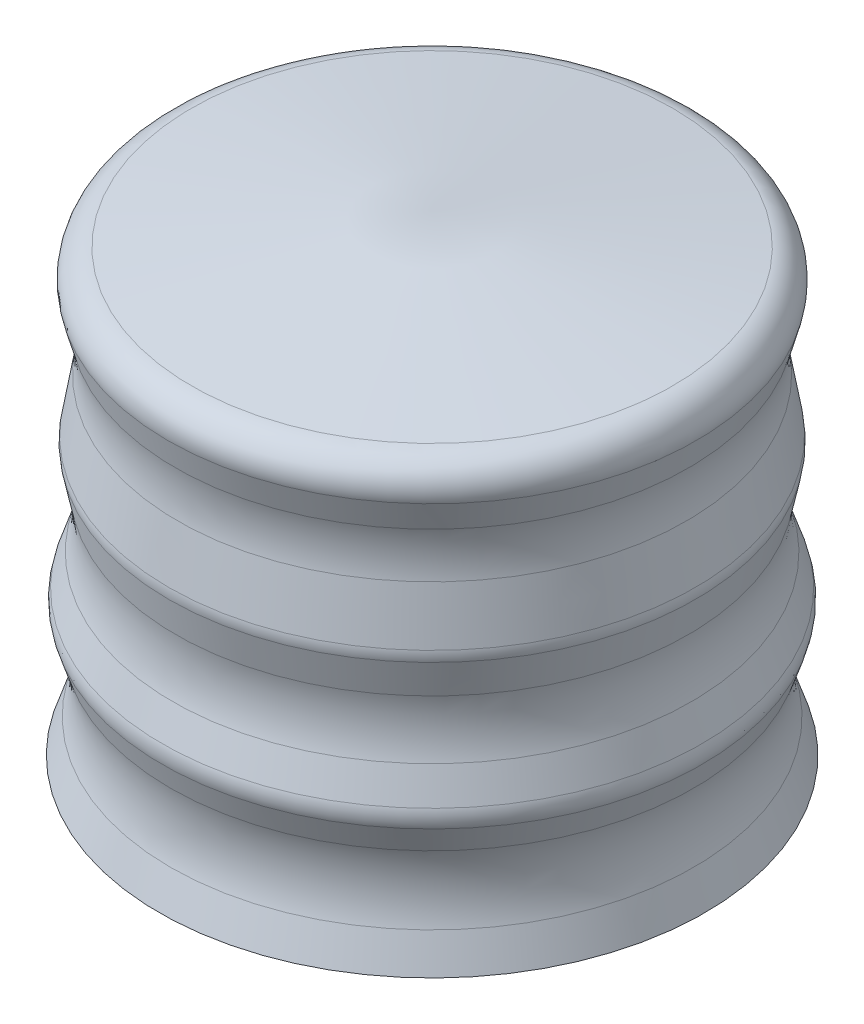
ISO-10303-21;
HEADER;
FILE_DESCRIPTION(('STEP AP214'),'2;1');
FILE_NAME('part.step','',(''),(''),'','','');
FILE_SCHEMA(('AUTOMOTIVE_DESIGN { 1 0 10303 214 1 1 1 1 }'));
ENDSEC;
DATA;
#1=APPLICATION_CONTEXT('core data for automotive mechanical design processes');
#2=APPLICATION_PROTOCOL_DEFINITION('international standard','automotive_design',2000,#1);
#3=PRODUCT_CONTEXT('',#1,'mechanical');
#4=PRODUCT('Part','Part','',(#3));
#5=PRODUCT_RELATED_PRODUCT_CATEGORY('part','',(#4));
#6=PRODUCT_DEFINITION_FORMATION('','',#4);
#7=PRODUCT_DEFINITION_CONTEXT('part definition',#1,'design');
#8=PRODUCT_DEFINITION('design','',#6,#7);
#9=PRODUCT_DEFINITION_SHAPE('','',#8);
#10=(LENGTH_UNIT() NAMED_UNIT(*) SI_UNIT(.MILLI.,.METRE.));
#11=(NAMED_UNIT(*) PLANE_ANGLE_UNIT() SI_UNIT($,.RADIAN.));
#12=(NAMED_UNIT(*) SI_UNIT($,.STERADIAN.) SOLID_ANGLE_UNIT());
#13=UNCERTAINTY_MEASURE_WITH_UNIT(LENGTH_MEASURE(1.E-05),#10,'distance_accuracy_value','');
#14=(GEOMETRIC_REPRESENTATION_CONTEXT(3) GLOBAL_UNCERTAINTY_ASSIGNED_CONTEXT((#13)) GLOBAL_UNIT_ASSIGNED_CONTEXT((#10,
#11,#12)) REPRESENTATION_CONTEXT('',''));
#15=CARTESIAN_POINT('',(0.,0.,0.));
#16=DIRECTION('',(0.,0.,1.));
#17=DIRECTION('',(1.,0.,0.));
#18=AXIS2_PLACEMENT_3D('',#15,#16,#17);
#19=CARTESIAN_POINT('',(0.,0.,0.));
#20=DIRECTION('',(0.,-1.,0.));
#21=DIRECTION('',(0.,0.,-1.));
#22=AXIS2_PLACEMENT_3D('',#19,#20,#21);
#23=PLANE('',#22);
#24=CARTESIAN_POINT('',(0.,0.,0.));
#25=DIRECTION('',(0.,-1.,0.));
#26=DIRECTION('',(0.,0.,-1.));
#27=AXIS2_PLACEMENT_3D('',#24,#25,#26);
#28=CIRCLE('',#27,4.82);
#29=CARTESIAN_POINT('',(0.,0.,-4.82));
#30=VERTEX_POINT('',#29);
#31=EDGE_CURVE('E11',#30,#30,#28,.T.);
#32=ORIENTED_EDGE('',*,*,#31,.T.);
#33=EDGE_LOOP('',(#32));
#34=FACE_BOUND('',#33,.T.);
#35=DIRECTION('',(1.,0.,0.));
#36=VECTOR('',#35,1.);
#37=CARTESIAN_POINT('',(1.55,0.,-0.25));
#38=LINE('',#37,#36);
#39=CARTESIAN_POINT('',(1.55,0.,-0.25));
#40=VERTEX_POINT('',#39);
#41=CARTESIAN_POINT('',(3.05,0.,-0.25));
#42=VERTEX_POINT('',#41);
#43=EDGE_CURVE('E223',#40,#42,#38,.T.);
#44=ORIENTED_EDGE('',*,*,#43,.F.);
#45=CARTESIAN_POINT('',(1.55,0.,0.));
#46=DIRECTION('',(0.,-1.,0.));
#47=DIRECTION('',(0.,0.,1.));
#48=AXIS2_PLACEMENT_3D('',#45,#46,#47);
#49=CIRCLE('',#48,0.25);
#50=CARTESIAN_POINT('',(1.55,0.,0.25));
#51=VERTEX_POINT('',#50);
#52=EDGE_CURVE('E219',#51,#40,#49,.T.);
#53=ORIENTED_EDGE('',*,*,#52,.F.);
#54=DIRECTION('',(-1.,0.,0.));
#55=VECTOR('',#54,1.);
#56=CARTESIAN_POINT('',(1.55,0.,0.25));
#57=LINE('',#56,#55);
#58=CARTESIAN_POINT('',(3.05,0.,0.25));
#59=VERTEX_POINT('',#58);
#60=EDGE_CURVE('E231',#59,#51,#57,.T.);
#61=ORIENTED_EDGE('',*,*,#60,.F.);
#62=CARTESIAN_POINT('',(3.05,0.,0.));
#63=DIRECTION('',(0.,-1.,0.));
#64=DIRECTION('',(0.,0.,-1.));
#65=AXIS2_PLACEMENT_3D('',#62,#63,#64);
#66=CIRCLE('',#65,0.25);
#67=EDGE_CURVE('E227',#42,#59,#66,.T.);
#68=ORIENTED_EDGE('',*,*,#67,.F.);
#69=EDGE_LOOP('',(#44,#53,#61,#68));
#70=FACE_BOUND('',#69,.T.);
#71=DIRECTION('',(0.,0.,1.));
#72=VECTOR('',#71,1.);
#73=CARTESIAN_POINT('',(0.249999999999995,0.,1.55));
#74=LINE('',#73,#72);
#75=CARTESIAN_POINT('',(0.249999999999995,0.,1.55));
#76=VERTEX_POINT('',#75);
#77=CARTESIAN_POINT('',(0.249999999999989,0.,3.05));
#78=VERTEX_POINT('',#77);
#79=EDGE_CURVE('E109',#76,#78,#74,.T.);
#80=ORIENTED_EDGE('',*,*,#79,.F.);
#81=CARTESIAN_POINT('',(0.,0.,1.55));
#82=DIRECTION('',(0.,-1.,0.));
#83=DIRECTION('',(-1.,0.,0.));
#84=AXIS2_PLACEMENT_3D('',#81,#82,#83);
#85=CIRCLE('',#84,0.25);
#86=CARTESIAN_POINT('',(-0.250000000000005,0.,1.55));
#87=VERTEX_POINT('',#86);
#88=EDGE_CURVE('E209',#87,#76,#85,.T.);
#89=ORIENTED_EDGE('',*,*,#88,.F.);
#90=DIRECTION('',(0.,0.,-1.));
#91=VECTOR('',#90,1.);
#92=CARTESIAN_POINT('',(-0.250000000000005,0.,1.55));
#93=LINE('',#92,#91);
#94=CARTESIAN_POINT('',(-0.250000000000011,0.,3.05));
#95=VERTEX_POINT('',#94);
#96=EDGE_CURVE('E216',#95,#87,#93,.T.);
#97=ORIENTED_EDGE('',*,*,#96,.F.);
#98=CARTESIAN_POINT('',(0.,0.,3.05));
#99=DIRECTION('',(0.,-1.,0.));
#100=DIRECTION('',(1.,0.,0.));
#101=AXIS2_PLACEMENT_3D('',#98,#99,#100);
#102=CIRCLE('',#101,0.25);
#103=EDGE_CURVE('E117',#78,#95,#102,.T.);
#104=ORIENTED_EDGE('',*,*,#103,.F.);
#105=EDGE_LOOP('',(#80,#89,#97,#104));
#106=FACE_BOUND('',#105,.T.);
#107=DIRECTION('',(-1.,0.,0.));
#108=VECTOR('',#107,1.);
#109=CARTESIAN_POINT('',(-1.55,0.,0.25));
#110=LINE('',#109,#108);
#111=CARTESIAN_POINT('',(-1.55,0.,0.25));
#112=VERTEX_POINT('',#111);
#113=CARTESIAN_POINT('',(-3.05,0.,0.25));
#114=VERTEX_POINT('',#113);
#115=EDGE_CURVE('E197',#112,#114,#110,.T.);
#116=ORIENTED_EDGE('',*,*,#115,.F.);
#117=CARTESIAN_POINT('',(-1.55,0.,0.));
#118=DIRECTION('',(0.,-1.,0.));
#119=DIRECTION('',(0.,0.,-1.));
#120=AXIS2_PLACEMENT_3D('',#117,#118,#119);
#121=CIRCLE('',#120,0.25);
#122=CARTESIAN_POINT('',(-1.55,0.,-0.25));
#123=VERTEX_POINT('',#122);
#124=EDGE_CURVE('E193',#123,#112,#121,.T.);
#125=ORIENTED_EDGE('',*,*,#124,.F.);
#126=DIRECTION('',(1.,0.,0.));
#127=VECTOR('',#126,1.);
#128=CARTESIAN_POINT('',(-1.55,0.,-0.25));
#129=LINE('',#128,#127);
#130=CARTESIAN_POINT('',(-3.05,0.,-0.25));
#131=VERTEX_POINT('',#130);
#132=EDGE_CURVE('E205',#131,#123,#129,.T.);
#133=ORIENTED_EDGE('',*,*,#132,.F.);
#134=CARTESIAN_POINT('',(-3.05,0.,0.));
#135=DIRECTION('',(0.,-1.,0.));
#136=DIRECTION('',(0.,0.,1.));
#137=AXIS2_PLACEMENT_3D('',#134,#135,#136);
#138=CIRCLE('',#137,0.25);
#139=EDGE_CURVE('E201',#114,#131,#138,.T.);
#140=ORIENTED_EDGE('',*,*,#139,.F.);
#141=EDGE_LOOP('',(#116,#125,#133,#140));
#142=FACE_BOUND('',#141,.T.);
#143=DIRECTION('',(0.,0.,-1.));
#144=VECTOR('',#143,1.);
#145=CARTESIAN_POINT('',(-0.249999999999984,0.,-1.55));
#146=LINE('',#145,#144);
#147=CARTESIAN_POINT('',(-0.249999999999984,0.,-1.55));
#148=VERTEX_POINT('',#147);
#149=CARTESIAN_POINT('',(-0.249999999999968,0.,-3.05));
#150=VERTEX_POINT('',#149);
#151=EDGE_CURVE('E183',#148,#150,#146,.T.);
#152=ORIENTED_EDGE('',*,*,#151,.F.);
#153=CARTESIAN_POINT('',(0.,0.,-1.55));
#154=DIRECTION('',(0.,-1.,0.));
#155=DIRECTION('',(1.,0.,0.));
#156=AXIS2_PLACEMENT_3D('',#153,#154,#155);
#157=CIRCLE('',#156,0.25);
#158=CARTESIAN_POINT('',(0.250000000000016,0.,-1.55));
#159=VERTEX_POINT('',#158);
#160=EDGE_CURVE('E179',#159,#148,#157,.T.);
#161=ORIENTED_EDGE('',*,*,#160,.F.);
#162=DIRECTION('',(0.,0.,1.));
#163=VECTOR('',#162,1.);
#164=CARTESIAN_POINT('',(0.250000000000016,0.,-1.55));
#165=LINE('',#164,#163);
#166=CARTESIAN_POINT('',(0.250000000000032,0.,-3.05));
#167=VERTEX_POINT('',#166);
#168=EDGE_CURVE('E190',#167,#159,#165,.T.);
#169=ORIENTED_EDGE('',*,*,#168,.F.);
#170=CARTESIAN_POINT('',(0.,0.,-3.05));
#171=DIRECTION('',(0.,-1.,0.));
#172=DIRECTION('',(-1.,0.,0.));
#173=AXIS2_PLACEMENT_3D('',#170,#171,#172);
#174=CIRCLE('',#173,0.25);
#175=EDGE_CURVE('E187',#150,#167,#174,.T.);
#176=ORIENTED_EDGE('',*,*,#175,.F.);
#177=EDGE_LOOP('',(#152,#161,#169,#176));
#178=FACE_BOUND('',#177,.T.);
#179=ADVANCED_FACE('F45',(#34,#70,#106,#142,#178),#23,.T.);
#180=CARTESIAN_POINT('',(0.,0.,0.));
#181=DIRECTION('',(0.,-1.,0.));
#182=DIRECTION('',(0.,0.,-1.));
#183=AXIS2_PLACEMENT_3D('',#180,#181,#182);
#184=CONICAL_SURFACE('',#183,4.82,0.321750554396642);
#185=CARTESIAN_POINT('',(0.,0.595056283609781,0.));
#186=DIRECTION('',(0.,-1.,0.));
#187=DIRECTION('',(0.,0.,-1.));
#188=AXIS2_PLACEMENT_3D('',#185,#186,#187);
#189=CIRCLE('',#188,4.62164790546341);
#190=CARTESIAN_POINT('',(0.,0.595056283609781,-4.62164790546341));
#191=VERTEX_POINT('',#190);
#192=EDGE_CURVE('E56',#191,#191,#189,.T.);
#193=ORIENTED_EDGE('',*,*,#192,.T.);
#194=EDGE_LOOP('',(#193));
#195=FACE_BOUND('',#194,.T.);
#196=ORIENTED_EDGE('',*,*,#31,.F.);
#197=EDGE_LOOP('',(#196));
#198=FACE_BOUND('',#197,.T.);
#199=ADVANCED_FACE('F284',(#195,#198),#184,.T.);
#200=CARTESIAN_POINT('',(0.,1.2,0.));
#201=DIRECTION('',(0.,-1.,0.));
#202=DIRECTION('',(0.,0.,-1.));
#203=AXIS2_PLACEMENT_3D('',#200,#201,#202);
#204=TOROIDAL_SURFACE('',#203,6.43647905463404,1.913);
#205=CARTESIAN_POINT('',(0.,1.80494371639022,0.));
#206=DIRECTION('',(0.,-1.,0.));
#207=DIRECTION('',(0.,0.,-1.));
#208=AXIS2_PLACEMENT_3D('',#205,#206,#207);
#209=CIRCLE('',#208,4.62164790546341);
#210=CARTESIAN_POINT('',(0.,1.80494371639022,-4.62164790546341));
#211=VERTEX_POINT('',#210);
#212=EDGE_CURVE('E275',#211,#211,#209,.T.);
#213=ORIENTED_EDGE('',*,*,#212,.T.);
#214=EDGE_LOOP('',(#213));
#215=FACE_BOUND('',#214,.T.);
#216=ORIENTED_EDGE('',*,*,#192,.F.);
#217=EDGE_LOOP('',(#216));
#218=FACE_BOUND('',#217,.T.);
#219=ADVANCED_FACE('F287',(#215,#218),#204,.F.);
#220=CARTESIAN_POINT('',(0.,1.80494371639022,0.));
#221=DIRECTION('',(0.,1.,0.));
#222=DIRECTION('',(0.,0.,1.));
#223=AXIS2_PLACEMENT_3D('',#220,#221,#222);
#224=CONICAL_SURFACE('',#223,4.62164790546341,0.321750554396642);
#225=CARTESIAN_POINT('',(0.,2.24188611699158,0.));
#226=DIRECTION('',(0.,-1.,0.));
#227=DIRECTION('',(0.,0.,-1.));
#228=AXIS2_PLACEMENT_3D('',#225,#226,#227);
#229=CIRCLE('',#228,4.76729537233053);
#230=CARTESIAN_POINT('',(0.,2.24188611699158,-4.76729537233053));
#231=VERTEX_POINT('',#230);
#232=EDGE_CURVE('E271',#231,#231,#229,.T.);
#233=ORIENTED_EDGE('',*,*,#232,.T.);
#234=EDGE_LOOP('',(#233));
#235=FACE_BOUND('',#234,.T.);
#236=ORIENTED_EDGE('',*,*,#212,.F.);
#237=EDGE_LOOP('',(#236));
#238=FACE_BOUND('',#237,.T.);
#239=ADVANCED_FACE('F289',(#235,#238),#224,.T.);
#240=CARTESIAN_POINT('',(0.,2.4,0.));
#241=DIRECTION('',(0.,-1.,0.));
#242=DIRECTION('',(0.,0.,-1.));
#243=AXIS2_PLACEMENT_3D('',#240,#241,#242);
#244=TOROIDAL_SURFACE('',#243,4.29295372330527,0.500000000000001);
#245=CARTESIAN_POINT('',(0.,2.55811388300842,0.));
#246=DIRECTION('',(0.,-1.,0.));
#247=DIRECTION('',(0.,0.,-1.));
#248=AXIS2_PLACEMENT_3D('',#245,#246,#247);
#249=CIRCLE('',#248,4.76729537233053);
#250=CARTESIAN_POINT('',(0.,2.55811388300842,-4.76729537233053));
#251=VERTEX_POINT('',#250);
#252=EDGE_CURVE('E267',#251,#251,#249,.T.);
#253=ORIENTED_EDGE('',*,*,#252,.T.);
#254=EDGE_LOOP('',(#253));
#255=FACE_BOUND('',#254,.T.);
#256=ORIENTED_EDGE('',*,*,#232,.F.);
#257=EDGE_LOOP('',(#256));
#258=FACE_BOUND('',#257,.T.);
#259=ADVANCED_FACE('F296',(#255,#258),#244,.T.);
#260=CARTESIAN_POINT('',(0.,2.55811388300842,0.));
#261=DIRECTION('',(0.,-1.,0.));
#262=DIRECTION('',(0.,0.,-1.));
#263=AXIS2_PLACEMENT_3D('',#260,#261,#262);
#264=CONICAL_SURFACE('',#263,4.76729537233053,0.321750554396642);
#265=CARTESIAN_POINT('',(0.,3.11026596358229,0.));
#266=DIRECTION('',(0.,-1.,0.));
#267=DIRECTION('',(0.,0.,-1.));
#268=AXIS2_PLACEMENT_3D('',#265,#266,#267);
#269=CIRCLE('',#268,4.5832446788059);
#270=CARTESIAN_POINT('',(0.,3.11026596358229,-4.5832446788059));
#271=VERTEX_POINT('',#270);
#272=EDGE_CURVE('E263',#271,#271,#269,.T.);
#273=ORIENTED_EDGE('',*,*,#272,.T.);
#274=EDGE_LOOP('',(#273));
#275=FACE_BOUND('',#274,.T.);
#276=ORIENTED_EDGE('',*,*,#252,.F.);
#277=EDGE_LOOP('',(#276));
#278=FACE_BOUND('',#277,.T.);
#279=ADVANCED_FACE('F475',(#275,#278),#264,.T.);
#280=CARTESIAN_POINT('',(0.,3.71520967997251,0.));
#281=DIRECTION('',(0.,-1.,0.));
#282=DIRECTION('',(0.,0.,-1.));
#283=AXIS2_PLACEMENT_3D('',#280,#281,#282);
#284=TOROIDAL_SURFACE('',#283,6.39807582797653,1.913);
#285=CARTESIAN_POINT('',(0.,4.10537416808878,0.));
#286=DIRECTION('',(0.,-1.,0.));
#287=DIRECTION('',(0.,0.,-1.));
#288=AXIS2_PLACEMENT_3D('',#285,#286,#287);
#289=CIRCLE('',#288,4.5252862850185);
#290=CARTESIAN_POINT('',(0.,4.10537416808878,-4.5252862850185));
#291=VERTEX_POINT('',#290);
#292=EDGE_CURVE('E259',#291,#291,#289,.T.);
#293=ORIENTED_EDGE('',*,*,#292,.T.);
#294=EDGE_LOOP('',(#293));
#295=FACE_BOUND('',#294,.T.);
#296=ORIENTED_EDGE('',*,*,#272,.F.);
#297=EDGE_LOOP('',(#296));
#298=FACE_BOUND('',#297,.T.);
#299=ADVANCED_FACE('F467',(#295,#298),#284,.F.);
#300=CARTESIAN_POINT('',(0.,4.10537416808878,0.));
#301=DIRECTION('',(0.,1.,0.));
#302=DIRECTION('',(0.,0.,1.));
#303=AXIS2_PLACEMENT_3D('',#300,#301,#302);
#304=CONICAL_SURFACE('',#303,4.5252862850185,0.205395389189767);
#305=CARTESIAN_POINT('',(0.,4.70684300208481,0.));
#306=DIRECTION('',(0.,-1.,0.));
#307=DIRECTION('',(0.,0.,-1.));
#308=AXIS2_PLACEMENT_3D('',#305,#306,#307);
#309=CIRCLE('',#308,4.650592292101);
#310=CARTESIAN_POINT('',(0.,4.70684300208481,-4.650592292101));
#311=VERTEX_POINT('',#310);
#312=EDGE_CURVE('E255',#311,#311,#309,.T.);
#313=ORIENTED_EDGE('',*,*,#312,.T.);
#314=EDGE_LOOP('',(#313));
#315=FACE_BOUND('',#314,.T.);
#316=ORIENTED_EDGE('',*,*,#292,.F.);
#317=EDGE_LOOP('',(#316));
#318=FACE_BOUND('',#317,.T.);
#319=ADVANCED_FACE('F459',(#315,#318),#304,.T.);
#320=CARTESIAN_POINT('',(0.,4.80882012914081,0.));
#321=DIRECTION('',(0.,-1.,0.));
#322=DIRECTION('',(0.,0.,-1.));
#323=AXIS2_PLACEMENT_3D('',#320,#321,#322);
#324=TOROIDAL_SURFACE('',#323,4.1611020822322,0.5);
#325=CARTESIAN_POINT('',(0.,4.89377358739463,0.));
#326=DIRECTION('',(0.,-1.,0.));
#327=DIRECTION('',(0.,0.,-1.));
#328=AXIS2_PLACEMENT_3D('',#325,#326,#327);
#329=CIRCLE('',#328,4.65383214010437);
#330=CARTESIAN_POINT('',(0.,4.89377358739463,-4.65383214010437));
#331=VERTEX_POINT('',#330);
#332=EDGE_CURVE('E251',#331,#331,#329,.T.);
#333=ORIENTED_EDGE('',*,*,#332,.T.);
#334=EDGE_LOOP('',(#333));
#335=FACE_BOUND('',#334,.T.);
#336=ORIENTED_EDGE('',*,*,#312,.F.);
#337=EDGE_LOOP('',(#336));
#338=FACE_BOUND('',#337,.T.);
#339=ADVANCED_FACE('F451',(#335,#338),#324,.T.);
#340=CARTESIAN_POINT('',(0.,4.89377358739463,0.));
#341=DIRECTION('',(0.,-1.,0.));
#342=DIRECTION('',(0.,0.,-1.));
#343=AXIS2_PLACEMENT_3D('',#340,#341,#342);
#344=CONICAL_SURFACE('',#343,4.65383214010437,0.170735211475282);
#345=CARTESIAN_POINT('',(0.,5.82853227102925,0.));
#346=DIRECTION('',(0.,-1.,0.));
#347=DIRECTION('',(0.,0.,-1.));
#348=AXIS2_PLACEMENT_3D('',#345,#346,#347);
#349=CIRCLE('',#348,4.49266684982254);
#350=CARTESIAN_POINT('',(0.,5.82853227102925,-4.49266684982254));
#351=VERTEX_POINT('',#350);
#352=EDGE_CURVE('E247',#351,#351,#349,.T.);
#353=ORIENTED_EDGE('',*,*,#352,.T.);
#354=EDGE_LOOP('',(#353));
#355=FACE_BOUND('',#354,.T.);
#356=ORIENTED_EDGE('',*,*,#332,.F.);
#357=EDGE_LOOP('',(#356));
#358=FACE_BOUND('',#357,.T.);
#359=ADVANCED_FACE('F443',(#355,#358),#344,.T.);
#360=CARTESIAN_POINT('',(0.,6.15356420230839,0.));
#361=DIRECTION('',(0.,-1.,0.));
#362=DIRECTION('',(0.,0.,-1.));
#363=AXIS2_PLACEMENT_3D('',#360,#361,#362);
#364=TOROIDAL_SURFACE('',#363,6.37785205124148,1.913);
#365=CARTESIAN_POINT('',(0.,6.66228637572307,0.));
#366=DIRECTION('',(0.,-1.,0.));
#367=DIRECTION('',(0.,0.,-1.));
#368=AXIS2_PLACEMENT_3D('',#365,#366,#367);
#369=CIRCLE('',#368,4.53373417261326);
#370=CARTESIAN_POINT('',(0.,6.66228637572307,-4.53373417261326));
#371=VERTEX_POINT('',#370);
#372=EDGE_CURVE('E243',#371,#371,#369,.T.);
#373=ORIENTED_EDGE('',*,*,#372,.T.);
#374=EDGE_LOOP('',(#373));
#375=FACE_BOUND('',#374,.T.);
#376=ORIENTED_EDGE('',*,*,#352,.F.);
#377=EDGE_LOOP('',(#376));
#378=FACE_BOUND('',#377,.T.);
#379=ADVANCED_FACE('F435',(#375,#378),#364,.F.);
#380=CARTESIAN_POINT('',(0.,6.66228637572307,0.));
#381=DIRECTION('',(0.,1.,0.));
#382=DIRECTION('',(0.,0.,1.));
#383=AXIS2_PLACEMENT_3D('',#380,#381,#382);
#384=CONICAL_SURFACE('',#383,4.53373417261326,0.269167492785702);
#385=CARTESIAN_POINT('',(0.,7.14628675755192,0.));
#386=DIRECTION('',(0.,-1.,0.));
#387=DIRECTION('',(0.,0.,-1.));
#388=AXIS2_PLACEMENT_3D('',#385,#386,#387);
#389=CIRCLE('',#388,4.66725151932467);
#390=CARTESIAN_POINT('',(0.,7.14628675755192,-4.66725151932467));
#391=VERTEX_POINT('',#390);
#392=EDGE_CURVE('E239',#391,#391,#389,.T.);
#393=ORIENTED_EDGE('',*,*,#392,.T.);
#394=EDGE_LOOP('',(#393));
#395=FACE_BOUND('',#394,.T.);
#396=ORIENTED_EDGE('',*,*,#372,.F.);
#397=EDGE_LOOP('',(#396));
#398=FACE_BOUND('',#397,.T.);
#399=ADVANCED_FACE('F427',(#395,#398),#384,.T.);
#400=CARTESIAN_POINT('',(0.,7.27925125661483,0.));
#401=DIRECTION('',(0.,-1.,0.));
#402=DIRECTION('',(0.,0.,-1.));
#403=AXIS2_PLACEMENT_3D('',#400,#401,#402);
#404=TOROIDAL_SURFACE('',#403,4.18525521022163,0.5);
#405=CARTESIAN_POINT('',(0.,7.77497368730173,0.));
#406=DIRECTION('',(0.,-1.,0.));
#407=DIRECTION('',(0.,0.,-1.));
#408=AXIS2_PLACEMENT_3D('',#405,#406,#407);
#409=CIRCLE('',#408,4.25051830633165);
#410=CARTESIAN_POINT('',(0.,7.77497368730173,-4.25051830633165));
#411=VERTEX_POINT('',#410);
#412=EDGE_CURVE('E235',#411,#411,#409,.T.);
#413=ORIENTED_EDGE('',*,*,#412,.T.);
#414=EDGE_LOOP('',(#413));
#415=FACE_BOUND('',#414,.T.);
#416=ORIENTED_EDGE('',*,*,#392,.F.);
#417=EDGE_LOOP('',(#416));
#418=FACE_BOUND('',#417,.T.);
#419=ADVANCED_FACE('F419',(#415,#418),#404,.T.);
#420=CARTESIAN_POINT('',(0.,7.77497368730173,0.));
#421=DIRECTION('',(0.,-1.,0.));
#422=DIRECTION('',(0.,0.,-1.));
#423=AXIS2_PLACEMENT_3D('',#420,#421,#422);
#424=CONICAL_SURFACE('',#423,4.25051830633165,1.43989663289533);
#425=CARTESIAN_POINT('',(0.,8.33456503837122,0.));
#426=VERTEX_POINT('',#425);
#427=VERTEX_LOOP('',#426);
#428=FACE_BOUND('',#427,.T.);
#429=ORIENTED_EDGE('',*,*,#412,.F.);
#430=EDGE_LOOP('',(#429));
#431=FACE_BOUND('',#430,.T.);
#432=ADVANCED_FACE('F323',(#428,#431),#424,.T.);
#433=CARTESIAN_POINT('',(-3.05,0.,0.));
#434=DIRECTION('',(0.,1.,0.));
#435=DIRECTION('',(0.,0.,1.));
#436=AXIS2_PLACEMENT_3D('',#433,#434,#435);
#437=SPHERICAL_SURFACE('',#436,0.25);
#438=CARTESIAN_POINT('',(-3.05,0.,0.));
#439=DIRECTION('',(1.,0.,0.));
#440=DIRECTION('',(0.,0.,-1.));
#441=AXIS2_PLACEMENT_3D('',#438,#439,#440);
#442=CIRCLE('',#441,0.25);
#443=CARTESIAN_POINT('',(-3.05,-0.25,0.));
#444=VERTEX_POINT('',#443);
#445=EDGE_CURVE('E176',#114,#444,#442,.T.);
#446=ORIENTED_EDGE('',*,*,#445,.F.);
#447=ORIENTED_EDGE('',*,*,#139,.T.);
#448=CARTESIAN_POINT('',(-3.05,0.,0.));
#449=DIRECTION('',(1.,0.,0.));
#450=DIRECTION('',(0.,0.,-1.));
#451=AXIS2_PLACEMENT_3D('',#448,#449,#450);
#452=CIRCLE('',#451,0.25);
#453=EDGE_CURVE('E170',#444,#131,#452,.T.);
#454=ORIENTED_EDGE('',*,*,#453,.F.);
#455=EDGE_LOOP('',(#446,#447,#454));
#456=FACE_BOUND('',#455,.T.);
#457=ADVANCED_FACE('F319',(#456),#437,.T.);
#458=CARTESIAN_POINT('',(-1.55,0.,0.));
#459=DIRECTION('',(-1.,0.,0.));
#460=DIRECTION('',(0.,0.,1.));
#461=AXIS2_PLACEMENT_3D('',#458,#459,#460);
#462=CYLINDRICAL_SURFACE('',#461,0.25);
#463=CARTESIAN_POINT('',(-1.55,0.,0.));
#464=DIRECTION('',(1.,0.,0.));
#465=DIRECTION('',(0.,0.,-1.));
#466=AXIS2_PLACEMENT_3D('',#463,#464,#465);
#467=CIRCLE('',#466,0.25);
#468=CARTESIAN_POINT('',(-1.55,-0.25,0.));
#469=VERTEX_POINT('',#468);
#470=EDGE_CURVE('E173',#112,#469,#467,.T.);
#471=ORIENTED_EDGE('',*,*,#470,.F.);
#472=ORIENTED_EDGE('',*,*,#115,.T.);
#473=ORIENTED_EDGE('',*,*,#445,.T.);
#474=DIRECTION('',(-1.,0.,0.));
#475=VECTOR('',#474,1.);
#476=CARTESIAN_POINT('',(-1.55,-0.25,0.));
#477=LINE('',#476,#475);
#478=EDGE_CURVE('E166',#469,#444,#477,.T.);
#479=ORIENTED_EDGE('',*,*,#478,.F.);
#480=EDGE_LOOP('',(#471,#472,#473,#479));
#481=FACE_BOUND('',#480,.T.);
#482=ADVANCED_FACE('F315',(#481),#462,.T.);
#483=CARTESIAN_POINT('',(-1.55,0.,0.));
#484=DIRECTION('',(0.,1.,0.));
#485=DIRECTION('',(0.,0.,1.));
#486=AXIS2_PLACEMENT_3D('',#483,#484,#485);
#487=SPHERICAL_SURFACE('',#486,0.25);
#488=ORIENTED_EDGE('',*,*,#124,.T.);
#489=ORIENTED_EDGE('',*,*,#470,.T.);
#490=CARTESIAN_POINT('',(-1.55,0.,0.));
#491=DIRECTION('',(-1.,0.,0.));
#492=DIRECTION('',(0.,0.,1.));
#493=AXIS2_PLACEMENT_3D('',#490,#491,#492);
#494=CIRCLE('',#493,0.25);
#495=EDGE_CURVE('E162',#123,#469,#494,.T.);
#496=ORIENTED_EDGE('',*,*,#495,.F.);
#497=EDGE_LOOP('',(#488,#489,#496));
#498=FACE_BOUND('',#497,.T.);
#499=ADVANCED_FACE('F311',(#498),#487,.T.);
#500=CARTESIAN_POINT('',(-1.55,0.,0.));
#501=DIRECTION('',(1.,0.,0.));
#502=DIRECTION('',(0.,0.,-1.));
#503=AXIS2_PLACEMENT_3D('',#500,#501,#502);
#504=CYLINDRICAL_SURFACE('',#503,0.25);
#505=ORIENTED_EDGE('',*,*,#453,.T.);
#506=ORIENTED_EDGE('',*,*,#132,.T.);
#507=ORIENTED_EDGE('',*,*,#495,.T.);
#508=ORIENTED_EDGE('',*,*,#478,.T.);
#509=EDGE_LOOP('',(#505,#506,#507,#508));
#510=FACE_BOUND('',#509,.T.);
#511=ADVANCED_FACE('F307',(#510),#504,.T.);
#512=CARTESIAN_POINT('',(0.,0.,-3.05));
#513=DIRECTION('',(0.,1.,0.));
#514=DIRECTION('',(0.,0.,1.));
#515=AXIS2_PLACEMENT_3D('',#512,#513,#514);
#516=SPHERICAL_SURFACE('',#515,0.25);
#517=CARTESIAN_POINT('',(0.,0.,-3.05));
#518=DIRECTION('',(0.,0.,1.));
#519=DIRECTION('',(1.,0.,0.));
#520=AXIS2_PLACEMENT_3D('',#517,#518,#519);
#521=CIRCLE('',#520,0.25);
#522=CARTESIAN_POINT('',(0.,-0.25,-3.05));
#523=VERTEX_POINT('',#522);
#524=EDGE_CURVE('E159',#150,#523,#521,.T.);
#525=ORIENTED_EDGE('',*,*,#524,.F.);
#526=ORIENTED_EDGE('',*,*,#175,.T.);
#527=CARTESIAN_POINT('',(0.,0.,-3.05));
#528=DIRECTION('',(0.,0.,1.));
#529=DIRECTION('',(1.,0.,0.));
#530=AXIS2_PLACEMENT_3D('',#527,#528,#529);
#531=CIRCLE('',#530,0.25);
#532=EDGE_CURVE('E65',#523,#167,#531,.T.);
#533=ORIENTED_EDGE('',*,*,#532,.F.);
#534=EDGE_LOOP('',(#525,#526,#533));
#535=FACE_BOUND('',#534,.T.);
#536=ADVANCED_FACE('F310',(#535),#516,.T.);
#537=CARTESIAN_POINT('',(0.,0.,-1.55));
#538=DIRECTION('',(0.,0.,-1.));
#539=DIRECTION('',(-1.,0.,0.));
#540=AXIS2_PLACEMENT_3D('',#537,#538,#539);
#541=CYLINDRICAL_SURFACE('',#540,0.25);
#542=CARTESIAN_POINT('',(0.,0.,-1.55));
#543=DIRECTION('',(0.,0.,1.));
#544=DIRECTION('',(1.,0.,0.));
#545=AXIS2_PLACEMENT_3D('',#542,#543,#544);
#546=CIRCLE('',#545,0.25);
#547=CARTESIAN_POINT('',(0.,-0.25,-1.55));
#548=VERTEX_POINT('',#547);
#549=EDGE_CURVE('E156',#148,#548,#546,.T.);
#550=ORIENTED_EDGE('',*,*,#549,.F.);
#551=ORIENTED_EDGE('',*,*,#151,.T.);
#552=ORIENTED_EDGE('',*,*,#524,.T.);
#553=DIRECTION('',(0.,0.,-1.));
#554=VECTOR('',#553,1.);
#555=CARTESIAN_POINT('',(0.,-0.25,-1.55));
#556=LINE('',#555,#554);
#557=EDGE_CURVE('E151',#548,#523,#556,.T.);
#558=ORIENTED_EDGE('',*,*,#557,.F.);
#559=EDGE_LOOP('',(#550,#551,#552,#558));
#560=FACE_BOUND('',#559,.T.);
#561=ADVANCED_FACE('F332',(#560),#541,.T.);
#562=CARTESIAN_POINT('',(0.,0.,-1.55));
#563=DIRECTION('',(0.,1.,0.));
#564=DIRECTION('',(0.,0.,1.));
#565=AXIS2_PLACEMENT_3D('',#562,#563,#564);
#566=SPHERICAL_SURFACE('',#565,0.25);
#567=ORIENTED_EDGE('',*,*,#160,.T.);
#568=ORIENTED_EDGE('',*,*,#549,.T.);
#569=CARTESIAN_POINT('',(0.,0.,-1.55));
#570=DIRECTION('',(0.,0.,-1.));
#571=DIRECTION('',(-1.,0.,0.));
#572=AXIS2_PLACEMENT_3D('',#569,#570,#571);
#573=CIRCLE('',#572,0.25);
#574=EDGE_CURVE('E148',#159,#548,#573,.T.);
#575=ORIENTED_EDGE('',*,*,#574,.F.);
#576=EDGE_LOOP('',(#567,#568,#575));
#577=FACE_BOUND('',#576,.T.);
#578=ADVANCED_FACE('F329',(#577),#566,.T.);
#579=CARTESIAN_POINT('',(0.,0.,-1.55));
#580=DIRECTION('',(0.,0.,1.));
#581=DIRECTION('',(1.,0.,0.));
#582=AXIS2_PLACEMENT_3D('',#579,#580,#581);
#583=CYLINDRICAL_SURFACE('',#582,0.25);
#584=ORIENTED_EDGE('',*,*,#532,.T.);
#585=ORIENTED_EDGE('',*,*,#168,.T.);
#586=ORIENTED_EDGE('',*,*,#574,.T.);
#587=ORIENTED_EDGE('',*,*,#557,.T.);
#588=EDGE_LOOP('',(#584,#585,#586,#587));
#589=FACE_BOUND('',#588,.T.);
#590=ADVANCED_FACE('F325',(#589),#583,.T.);
#591=CARTESIAN_POINT('',(3.05,0.,0.));
#592=DIRECTION('',(0.,1.,0.));
#593=DIRECTION('',(0.,0.,1.));
#594=AXIS2_PLACEMENT_3D('',#591,#592,#593);
#595=SPHERICAL_SURFACE('',#594,0.25);
#596=CARTESIAN_POINT('',(3.05,0.,0.));
#597=DIRECTION('',(-1.,0.,0.));
#598=DIRECTION('',(0.,0.,1.));
#599=AXIS2_PLACEMENT_3D('',#596,#597,#598);
#600=CIRCLE('',#599,0.25);
#601=CARTESIAN_POINT('',(3.05,-0.25,0.));
#602=VERTEX_POINT('',#601);
#603=EDGE_CURVE('E145',#42,#602,#600,.T.);
#604=ORIENTED_EDGE('',*,*,#603,.F.);
#605=ORIENTED_EDGE('',*,*,#67,.T.);
#606=CARTESIAN_POINT('',(3.05,0.,0.));
#607=DIRECTION('',(-1.,0.,0.));
#608=DIRECTION('',(0.,0.,1.));
#609=AXIS2_PLACEMENT_3D('',#606,#607,#608);
#610=CIRCLE('',#609,0.25);
#611=EDGE_CURVE('E138',#602,#59,#610,.T.);
#612=ORIENTED_EDGE('',*,*,#611,.F.);
#613=EDGE_LOOP('',(#604,#605,#612));
#614=FACE_BOUND('',#613,.T.);
#615=ADVANCED_FACE('F328',(#614),#595,.T.);
#616=CARTESIAN_POINT('',(1.55,0.,0.));
#617=DIRECTION('',(1.,0.,0.));
#618=DIRECTION('',(0.,0.,-1.));
#619=AXIS2_PLACEMENT_3D('',#616,#617,#618);
#620=CYLINDRICAL_SURFACE('',#619,0.25);
#621=CARTESIAN_POINT('',(1.55,0.,0.));
#622=DIRECTION('',(-1.,0.,0.));
#623=DIRECTION('',(0.,0.,1.));
#624=AXIS2_PLACEMENT_3D('',#621,#622,#623);
#625=CIRCLE('',#624,0.25);
#626=CARTESIAN_POINT('',(1.55,-0.25,0.));
#627=VERTEX_POINT('',#626);
#628=EDGE_CURVE('E142',#40,#627,#625,.T.);
#629=ORIENTED_EDGE('',*,*,#628,.F.);
#630=ORIENTED_EDGE('',*,*,#43,.T.);
#631=ORIENTED_EDGE('',*,*,#603,.T.);
#632=DIRECTION('',(1.,0.,0.));
#633=VECTOR('',#632,1.);
#634=CARTESIAN_POINT('',(1.55,-0.25,0.));
#635=LINE('',#634,#633);
#636=EDGE_CURVE('E134',#627,#602,#635,.T.);
#637=ORIENTED_EDGE('',*,*,#636,.F.);
#638=EDGE_LOOP('',(#629,#630,#631,#637));
#639=FACE_BOUND('',#638,.T.);
#640=ADVANCED_FACE('F347',(#639),#620,.T.);
#641=CARTESIAN_POINT('',(1.55,0.,0.));
#642=DIRECTION('',(0.,1.,0.));
#643=DIRECTION('',(0.,0.,1.));
#644=AXIS2_PLACEMENT_3D('',#641,#642,#643);
#645=SPHERICAL_SURFACE('',#644,0.25);
#646=ORIENTED_EDGE('',*,*,#52,.T.);
#647=ORIENTED_EDGE('',*,*,#628,.T.);
#648=CARTESIAN_POINT('',(1.55,0.,0.));
#649=DIRECTION('',(1.,0.,0.));
#650=DIRECTION('',(0.,0.,-1.));
#651=AXIS2_PLACEMENT_3D('',#648,#649,#650);
#652=CIRCLE('',#651,0.25);
#653=EDGE_CURVE('E113',#51,#627,#652,.T.);
#654=ORIENTED_EDGE('',*,*,#653,.F.);
#655=EDGE_LOOP('',(#646,#647,#654));
#656=FACE_BOUND('',#655,.T.);
#657=ADVANCED_FACE('F343',(#656),#645,.T.);
#658=CARTESIAN_POINT('',(1.55,0.,0.));
#659=DIRECTION('',(-1.,0.,0.));
#660=DIRECTION('',(0.,0.,1.));
#661=AXIS2_PLACEMENT_3D('',#658,#659,#660);
#662=CYLINDRICAL_SURFACE('',#661,0.25);
#663=ORIENTED_EDGE('',*,*,#611,.T.);
#664=ORIENTED_EDGE('',*,*,#60,.T.);
#665=ORIENTED_EDGE('',*,*,#653,.T.);
#666=ORIENTED_EDGE('',*,*,#636,.T.);
#667=EDGE_LOOP('',(#663,#664,#665,#666));
#668=FACE_BOUND('',#667,.T.);
#669=ADVANCED_FACE('F340',(#668),#662,.T.);
#670=CARTESIAN_POINT('',(0.,0.,3.05));
#671=DIRECTION('',(0.,1.,0.));
#672=DIRECTION('',(0.,0.,1.));
#673=AXIS2_PLACEMENT_3D('',#670,#671,#672);
#674=SPHERICAL_SURFACE('',#673,0.25);
#675=CARTESIAN_POINT('',(0.,0.,3.05));
#676=DIRECTION('',(0.,0.,-1.));
#677=DIRECTION('',(-1.,0.,0.));
#678=AXIS2_PLACEMENT_3D('',#675,#676,#677);
#679=CIRCLE('',#678,0.25);
#680=CARTESIAN_POINT('',(0.,-0.25,3.05));
#681=VERTEX_POINT('',#680);
#682=EDGE_CURVE('E49',#78,#681,#679,.T.);
#683=ORIENTED_EDGE('',*,*,#682,.F.);
#684=ORIENTED_EDGE('',*,*,#103,.T.);
#685=CARTESIAN_POINT('',(0.,0.,3.05));
#686=DIRECTION('',(0.,0.,-1.));
#687=DIRECTION('',(-1.,0.,0.));
#688=AXIS2_PLACEMENT_3D('',#685,#686,#687);
#689=CIRCLE('',#688,0.25);
#690=EDGE_CURVE('E115',#681,#95,#689,.T.);
#691=ORIENTED_EDGE('',*,*,#690,.F.);
#692=EDGE_LOOP('',(#683,#684,#691));
#693=FACE_BOUND('',#692,.T.);
#694=ADVANCED_FACE('F47',(#693),#674,.T.);
#695=CARTESIAN_POINT('',(0.,0.,1.55));
#696=DIRECTION('',(0.,0.,1.));
#697=DIRECTION('',(1.,0.,0.));
#698=AXIS2_PLACEMENT_3D('',#695,#696,#697);
#699=CYLINDRICAL_SURFACE('',#698,0.25);
#700=CARTESIAN_POINT('',(0.,0.,1.55));
#701=DIRECTION('',(0.,0.,-1.));
#702=DIRECTION('',(-1.,0.,0.));
#703=AXIS2_PLACEMENT_3D('',#700,#701,#702);
#704=CIRCLE('',#703,0.25);
#705=CARTESIAN_POINT('',(0.,-0.25,1.55));
#706=VERTEX_POINT('',#705);
#707=EDGE_CURVE('E96',#76,#706,#704,.T.);
#708=ORIENTED_EDGE('',*,*,#707,.F.);
#709=ORIENTED_EDGE('',*,*,#79,.T.);
#710=ORIENTED_EDGE('',*,*,#682,.T.);
#711=DIRECTION('',(0.,0.,1.));
#712=VECTOR('',#711,1.);
#713=CARTESIAN_POINT('',(0.,-0.25,1.55));
#714=LINE('',#713,#712);
#715=EDGE_CURVE('E105',#706,#681,#714,.T.);
#716=ORIENTED_EDGE('',*,*,#715,.F.);
#717=EDGE_LOOP('',(#708,#709,#710,#716));
#718=FACE_BOUND('',#717,.T.);
#719=ADVANCED_FACE('F103',(#718),#699,.T.);
#720=CARTESIAN_POINT('',(0.,0.,1.55));
#721=DIRECTION('',(0.,1.,0.));
#722=DIRECTION('',(0.,0.,1.));
#723=AXIS2_PLACEMENT_3D('',#720,#721,#722);
#724=SPHERICAL_SURFACE('',#723,0.25);
#725=ORIENTED_EDGE('',*,*,#88,.T.);
#726=ORIENTED_EDGE('',*,*,#707,.T.);
#727=CARTESIAN_POINT('',(0.,0.,1.55));
#728=DIRECTION('',(0.,0.,1.));
#729=DIRECTION('',(1.,0.,0.));
#730=AXIS2_PLACEMENT_3D('',#727,#728,#729);
#731=CIRCLE('',#730,0.25);
#732=EDGE_CURVE('E124',#87,#706,#731,.T.);
#733=ORIENTED_EDGE('',*,*,#732,.F.);
#734=EDGE_LOOP('',(#725,#726,#733));
#735=FACE_BOUND('',#734,.T.);
#736=ADVANCED_FACE('F357',(#735),#724,.T.);
#737=CARTESIAN_POINT('',(0.,0.,1.55));
#738=DIRECTION('',(0.,0.,-1.));
#739=DIRECTION('',(-1.,0.,0.));
#740=AXIS2_PLACEMENT_3D('',#737,#738,#739);
#741=CYLINDRICAL_SURFACE('',#740,0.25);
#742=ORIENTED_EDGE('',*,*,#690,.T.);
#743=ORIENTED_EDGE('',*,*,#96,.T.);
#744=ORIENTED_EDGE('',*,*,#732,.T.);
#745=ORIENTED_EDGE('',*,*,#715,.T.);
#746=EDGE_LOOP('',(#742,#743,#744,#745));
#747=FACE_BOUND('',#746,.T.);
#748=ADVANCED_FACE('F123',(#747),#741,.T.);
#749=CLOSED_SHELL('',(#179,#199,#219,#239,#259,#279,#299,#319,#339,#359,#379,#399,#419,#432,
#457,#482,#499,#511,#536,#561,#578,#590,#615,#640,#657,#669,#694,#719,#736,#748));
#750=MANIFOLD_SOLID_BREP('B2',#749);
#751=ADVANCED_BREP_SHAPE_REPRESENTATION('',(#18,#750),#14);
#752=SHAPE_DEFINITION_REPRESENTATION(#9,#751);
ENDSEC;
END-ISO-10303-21;
